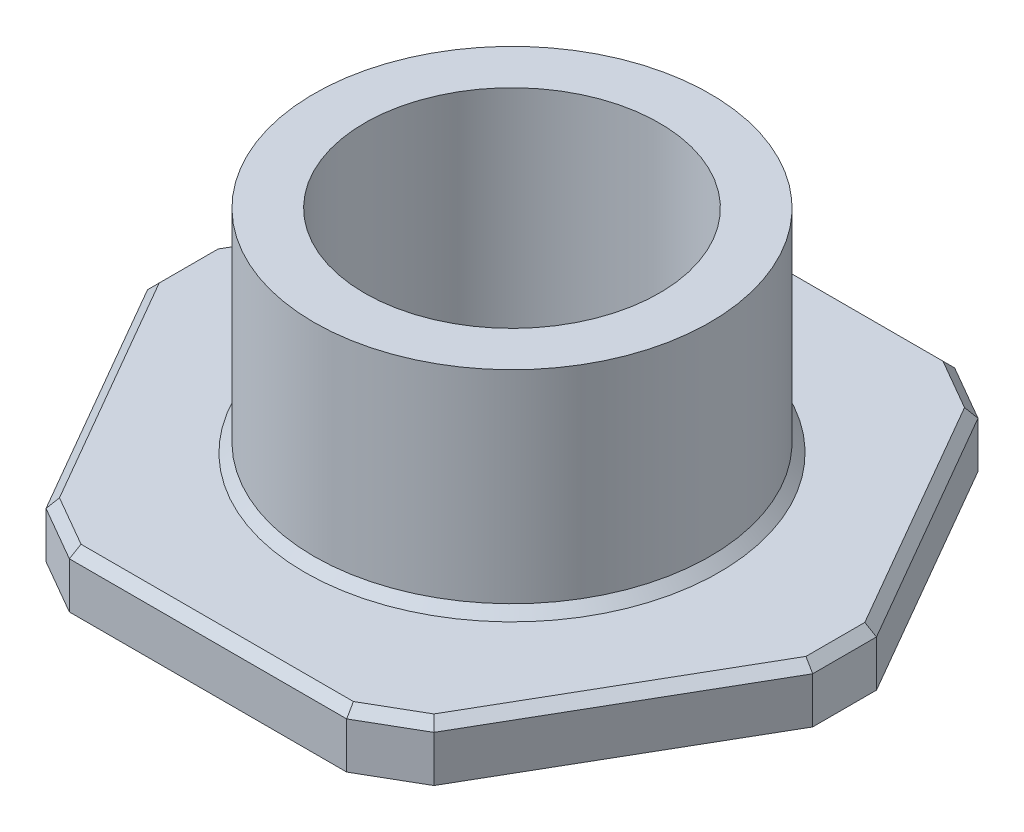
ISO-10303-21;
HEADER;
FILE_DESCRIPTION(('STEP AP214'),'2;1');
FILE_NAME('part.step','',(''),(''),'','','');
FILE_SCHEMA(('AUTOMOTIVE_DESIGN { 1 0 10303 214 1 1 1 1 }'));
ENDSEC;
DATA;
#1=APPLICATION_CONTEXT('core data for automotive mechanical design processes');
#2=APPLICATION_PROTOCOL_DEFINITION('international standard','automotive_design',2000,#1);
#3=PRODUCT_CONTEXT('',#1,'mechanical');
#4=PRODUCT('Part','Part','',(#3));
#5=PRODUCT_RELATED_PRODUCT_CATEGORY('part','',(#4));
#6=PRODUCT_DEFINITION_FORMATION('','',#4);
#7=PRODUCT_DEFINITION_CONTEXT('part definition',#1,'design');
#8=PRODUCT_DEFINITION('design','',#6,#7);
#9=PRODUCT_DEFINITION_SHAPE('','',#8);
#10=(LENGTH_UNIT() NAMED_UNIT(*) SI_UNIT(.MILLI.,.METRE.));
#11=(NAMED_UNIT(*) PLANE_ANGLE_UNIT() SI_UNIT($,.RADIAN.));
#12=(NAMED_UNIT(*) SI_UNIT($,.STERADIAN.) SOLID_ANGLE_UNIT());
#13=UNCERTAINTY_MEASURE_WITH_UNIT(LENGTH_MEASURE(1.E-05),#10,'distance_accuracy_value','');
#14=(GEOMETRIC_REPRESENTATION_CONTEXT(3) GLOBAL_UNCERTAINTY_ASSIGNED_CONTEXT((#13)) GLOBAL_UNIT_ASSIGNED_CONTEXT((#10,
#11,#12)) REPRESENTATION_CONTEXT('',''));
#15=CARTESIAN_POINT('',(0.,0.,0.));
#16=DIRECTION('',(0.,0.,1.));
#17=DIRECTION('',(1.,0.,0.));
#18=AXIS2_PLACEMENT_3D('',#15,#16,#17);
#19=CARTESIAN_POINT('',(0.,6.,0.));
#20=DIRECTION('',(0.,1.,0.));
#21=DIRECTION('',(0.,0.,1.));
#22=AXIS2_PLACEMENT_3D('',#19,#20,#21);
#23=PLANE('',#22);
#24=CARTESIAN_POINT('',(0.,6.,0.));
#25=DIRECTION('',(0.,1.,0.));
#26=DIRECTION('',(0.,0.,1.));
#27=AXIS2_PLACEMENT_3D('',#24,#25,#26);
#28=CIRCLE('',#27,22.4999999999999);
#29=CARTESIAN_POINT('',(0.,6.,22.4999999999999));
#30=VERTEX_POINT('',#29);
#31=EDGE_CURVE('E299',#30,#30,#28,.F.);
#32=ORIENTED_EDGE('',*,*,#31,.T.);
#33=EDGE_LOOP('',(#32));
#34=FACE_BOUND('',#33,.T.);
#35=DIRECTION('',(-1.,0.,0.));
#36=VECTOR('',#35,1.);
#37=CARTESIAN_POINT('',(-15.0525588832576,6.,-32.));
#38=LINE('',#37,#36);
#39=CARTESIAN_POINT('',(14.7846096908265,6.,-32.));
#40=VERTEX_POINT('',#39);
#41=CARTESIAN_POINT('',(-14.7846096908265,6.,-32.));
#42=VERTEX_POINT('',#41);
#43=EDGE_CURVE('E292',#40,#42,#38,.T.);
#44=ORIENTED_EDGE('',*,*,#43,.T.);
#45=DIRECTION('',(-0.866025403784438,0.,0.500000000000001));
#46=VECTOR('',#45,1.);
#47=CARTESIAN_POINT('',(-17.5525588832577,6.,-30.4019237886467));
#48=LINE('',#47,#46);
#49=CARTESIAN_POINT('',(-20.3205080756888,6.,-28.8038475772933));
#50=VERTEX_POINT('',#49);
#51=EDGE_CURVE('E295',#42,#50,#48,.T.);
#52=ORIENTED_EDGE('',*,*,#51,.T.);
#53=DIRECTION('',(-0.5,0.,0.866025403784439));
#54=VECTOR('',#53,1.);
#55=CARTESIAN_POINT('',(-35.2390923627309,6.,-2.9641016151378));
#56=LINE('',#55,#54);
#57=CARTESIAN_POINT('',(-35.1051177665153,6.,-3.19615242270667));
#58=VERTEX_POINT('',#57);
#59=EDGE_CURVE('E262',#50,#58,#56,.T.);
#60=ORIENTED_EDGE('',*,*,#59,.T.);
#61=DIRECTION('',(0.,0.,1.));
#62=VECTOR('',#61,1.);
#63=CARTESIAN_POINT('',(-35.1051177665153,6.,0.));
#64=LINE('',#63,#62);
#65=CARTESIAN_POINT('',(-35.1051177665153,6.,3.19615242270665));
#66=VERTEX_POINT('',#65);
#67=EDGE_CURVE('E265',#58,#66,#64,.T.);
#68=ORIENTED_EDGE('',*,*,#67,.T.);
#69=DIRECTION('',(0.5,0.,0.866025403784439));
#70=VECTOR('',#69,1.);
#71=CARTESIAN_POINT('',(-20.1865334794732,6.,29.0358983848622));
#72=LINE('',#71,#70);
#73=CARTESIAN_POINT('',(-20.3205080756888,6.,28.8038475772934));
#74=VERTEX_POINT('',#73);
#75=EDGE_CURVE('E268',#66,#74,#72,.T.);
#76=ORIENTED_EDGE('',*,*,#75,.T.);
#77=DIRECTION('',(0.866025403784438,0.,0.500000000000001));
#78=VECTOR('',#77,1.);
#79=CARTESIAN_POINT('',(-17.5525588832577,6.,30.4019237886467));
#80=LINE('',#79,#78);
#81=CARTESIAN_POINT('',(-14.7846096908265,6.,32.));
#82=VERTEX_POINT('',#81);
#83=EDGE_CURVE('E271',#74,#82,#80,.T.);
#84=ORIENTED_EDGE('',*,*,#83,.T.);
#85=DIRECTION('',(1.,0.,0.));
#86=VECTOR('',#85,1.);
#87=CARTESIAN_POINT('',(15.0525588832576,6.,32.));
#88=LINE('',#87,#86);
#89=CARTESIAN_POINT('',(14.7846096908265,6.,32.));
#90=VERTEX_POINT('',#89);
#91=EDGE_CURVE('E274',#82,#90,#88,.T.);
#92=ORIENTED_EDGE('',*,*,#91,.T.);
#93=DIRECTION('',(0.866025403784438,0.,-0.500000000000001));
#94=VECTOR('',#93,1.);
#95=CARTESIAN_POINT('',(17.5525588832577,6.,30.4019237886467));
#96=LINE('',#95,#94);
#97=CARTESIAN_POINT('',(20.3205080756888,6.,28.8038475772934));
#98=VERTEX_POINT('',#97);
#99=EDGE_CURVE('E277',#90,#98,#96,.T.);
#100=ORIENTED_EDGE('',*,*,#99,.T.);
#101=DIRECTION('',(0.5,0.,-0.866025403784439));
#102=VECTOR('',#101,1.);
#103=CARTESIAN_POINT('',(35.2390923627309,6.,2.96410161513777));
#104=LINE('',#103,#102);
#105=CARTESIAN_POINT('',(35.1051177665153,6.,3.19615242270664));
#106=VERTEX_POINT('',#105);
#107=EDGE_CURVE('E280',#98,#106,#104,.T.);
#108=ORIENTED_EDGE('',*,*,#107,.T.);
#109=DIRECTION('',(0.,0.,-1.));
#110=VECTOR('',#109,1.);
#111=CARTESIAN_POINT('',(35.1051177665153,6.,0.));
#112=LINE('',#111,#110);
#113=CARTESIAN_POINT('',(35.1051177665153,6.,-3.19615242270665));
#114=VERTEX_POINT('',#113);
#115=EDGE_CURVE('E283',#106,#114,#112,.T.);
#116=ORIENTED_EDGE('',*,*,#115,.T.);
#117=DIRECTION('',(-0.5,0.,-0.866025403784439));
#118=VECTOR('',#117,1.);
#119=CARTESIAN_POINT('',(20.1865334794732,6.,-29.0358983848622));
#120=LINE('',#119,#118);
#121=CARTESIAN_POINT('',(20.3205080756888,6.,-28.8038475772934));
#122=VERTEX_POINT('',#121);
#123=EDGE_CURVE('E286',#114,#122,#120,.T.);
#124=ORIENTED_EDGE('',*,*,#123,.T.);
#125=DIRECTION('',(-0.866025403784439,0.,-0.5));
#126=VECTOR('',#125,1.);
#127=CARTESIAN_POINT('',(17.5525588832576,6.,-30.4019237886467));
#128=LINE('',#127,#126);
#129=EDGE_CURVE('E289',#122,#40,#128,.T.);
#130=ORIENTED_EDGE('',*,*,#129,.T.);
#131=EDGE_LOOP('',(#44,#52,#60,#68,#76,#84,#92,#100,#108,#116,#124,#130));
#132=FACE_BOUND('',#131,.T.);
#133=ADVANCED_FACE('F47',(#34,#132),#23,.T.);
#134=CARTESIAN_POINT('',(0.,0.,0.));
#135=DIRECTION('',(0.,1.,0.));
#136=DIRECTION('',(0.,0.,1.));
#137=AXIS2_PLACEMENT_3D('',#134,#135,#136);
#138=PLANE('',#137);
#139=DIRECTION('',(0.5,0.,0.866025403784439));
#140=VECTOR('',#139,1.);
#141=CARTESIAN_POINT('',(-38.1051177665153,0.,0.));
#142=LINE('',#141,#140);
#143=CARTESIAN_POINT('',(-36.1051177665153,0.,3.46410161513778));
#144=VERTEX_POINT('',#143);
#145=CARTESIAN_POINT('',(-21.0525588832577,0.,29.5358983848622));
#146=VERTEX_POINT('',#145);
#147=EDGE_CURVE('E178',#144,#146,#142,.T.);
#148=ORIENTED_EDGE('',*,*,#147,.F.);
#149=DIRECTION('',(0.,0.,1.));
#150=VECTOR('',#149,1.);
#151=CARTESIAN_POINT('',(-36.1051177665153,0.,3.46410161513778));
#152=LINE('',#151,#150);
#153=CARTESIAN_POINT('',(-36.1051177665153,0.,-3.46410161513779));
#154=VERTEX_POINT('',#153);
#155=EDGE_CURVE('E185',#144,#154,#152,.F.);
#156=ORIENTED_EDGE('',*,*,#155,.T.);
#157=DIRECTION('',(-0.5,0.,0.866025403784439));
#158=VECTOR('',#157,1.);
#159=CARTESIAN_POINT('',(-19.0525588832577,0.,-33.));
#160=LINE('',#159,#158);
#161=CARTESIAN_POINT('',(-21.0525588832577,0.,-29.5358983848622));
#162=VERTEX_POINT('',#161);
#163=EDGE_CURVE('E201',#162,#154,#160,.T.);
#164=ORIENTED_EDGE('',*,*,#163,.F.);
#165=DIRECTION('',(-0.866025403784438,0.,0.500000000000001));
#166=VECTOR('',#165,1.);
#167=CARTESIAN_POINT('',(-21.0525588832577,0.,-29.5358983848622));
#168=LINE('',#167,#166);
#169=CARTESIAN_POINT('',(-15.0525588832576,0.,-33.));
#170=VERTEX_POINT('',#169);
#171=EDGE_CURVE('E182',#162,#170,#168,.F.);
#172=ORIENTED_EDGE('',*,*,#171,.T.);
#173=DIRECTION('',(-1.,0.,0.));
#174=VECTOR('',#173,1.);
#175=CARTESIAN_POINT('',(19.0525588832576,0.,-33.));
#176=LINE('',#175,#174);
#177=CARTESIAN_POINT('',(15.0525588832576,0.,-33.));
#178=VERTEX_POINT('',#177);
#179=EDGE_CURVE('E207',#178,#170,#176,.T.);
#180=ORIENTED_EDGE('',*,*,#179,.F.);
#181=DIRECTION('',(-0.866025403784439,0.,-0.5));
#182=VECTOR('',#181,1.);
#183=CARTESIAN_POINT('',(15.0525588832576,0.,-33.));
#184=LINE('',#183,#182);
#185=CARTESIAN_POINT('',(21.0525588832577,0.,-29.5358983848622));
#186=VERTEX_POINT('',#185);
#187=EDGE_CURVE('E215',#178,#186,#184,.F.);
#188=ORIENTED_EDGE('',*,*,#187,.T.);
#189=DIRECTION('',(-0.5,0.,-0.866025403784439));
#190=VECTOR('',#189,1.);
#191=CARTESIAN_POINT('',(38.1051177665153,0.,0.));
#192=LINE('',#191,#190);
#193=CARTESIAN_POINT('',(36.1051177665153,0.,-3.46410161513778));
#194=VERTEX_POINT('',#193);
#195=EDGE_CURVE('E404',#194,#186,#192,.T.);
#196=ORIENTED_EDGE('',*,*,#195,.F.);
#197=DIRECTION('',(0.,0.,-1.));
#198=VECTOR('',#197,1.);
#199=CARTESIAN_POINT('',(36.1051177665153,0.,-3.46410161513778));
#200=LINE('',#199,#198);
#201=CARTESIAN_POINT('',(36.1051177665153,0.,3.46410161513776));
#202=VERTEX_POINT('',#201);
#203=EDGE_CURVE('E218',#194,#202,#200,.F.);
#204=ORIENTED_EDGE('',*,*,#203,.T.);
#205=DIRECTION('',(0.5,0.,-0.866025403784439));
#206=VECTOR('',#205,1.);
#207=CARTESIAN_POINT('',(19.0525588832577,0.,33.));
#208=LINE('',#207,#206);
#209=CARTESIAN_POINT('',(21.0525588832577,0.,29.5358983848622));
#210=VERTEX_POINT('',#209);
#211=EDGE_CURVE('E400',#210,#202,#208,.T.);
#212=ORIENTED_EDGE('',*,*,#211,.F.);
#213=DIRECTION('',(0.866025403784438,0.,-0.500000000000001));
#214=VECTOR('',#213,1.);
#215=CARTESIAN_POINT('',(21.0525588832577,0.,29.5358983848622));
#216=LINE('',#215,#214);
#217=CARTESIAN_POINT('',(15.0525588832576,0.,33.));
#218=VERTEX_POINT('',#217);
#219=EDGE_CURVE('E221',#210,#218,#216,.F.);
#220=ORIENTED_EDGE('',*,*,#219,.T.);
#221=DIRECTION('',(1.,0.,0.));
#222=VECTOR('',#221,1.);
#223=CARTESIAN_POINT('',(-19.0525588832577,0.,33.));
#224=LINE('',#223,#222);
#225=CARTESIAN_POINT('',(-15.0525588832577,0.,33.));
#226=VERTEX_POINT('',#225);
#227=EDGE_CURVE('E200',#226,#218,#224,.T.);
#228=ORIENTED_EDGE('',*,*,#227,.F.);
#229=DIRECTION('',(0.866025403784438,0.,0.500000000000001));
#230=VECTOR('',#229,1.);
#231=CARTESIAN_POINT('',(-15.0525588832577,0.,33.));
#232=LINE('',#231,#230);
#233=EDGE_CURVE('E193',#226,#146,#232,.F.);
#234=ORIENTED_EDGE('',*,*,#233,.T.);
#235=EDGE_LOOP('',(#148,#156,#164,#172,#180,#188,#196,#204,#212,#220,#228,#234));
#236=FACE_BOUND('',#235,.T.);
#237=CARTESIAN_POINT('',(0.,0.,0.));
#238=DIRECTION('',(0.,1.,0.));
#239=DIRECTION('',(0.,0.,1.));
#240=AXIS2_PLACEMENT_3D('',#237,#238,#239);
#241=CIRCLE('',#240,16.);
#242=CARTESIAN_POINT('',(0.,0.,16.));
#243=VERTEX_POINT('',#242);
#244=EDGE_CURVE('E394',#243,#243,#241,.T.);
#245=ORIENTED_EDGE('',*,*,#244,.T.);
#246=EDGE_LOOP('',(#245));
#247=FACE_BOUND('',#246,.T.);
#248=ADVANCED_FACE('F195',(#236,#247),#138,.F.);
#249=CARTESIAN_POINT('',(19.0525588832577,6.,33.));
#250=DIRECTION('',(-0.866025403784439,0.,-0.5));
#251=DIRECTION('',(-0.5,0.,0.866025403784439));
#252=AXIS2_PLACEMENT_3D('',#249,#250,#251);
#253=PLANE('',#252);
#254=DIRECTION('',(0.,1.,0.));
#255=VECTOR('',#254,1.);
#256=CARTESIAN_POINT('',(36.1051177665153,6.,3.46410161513776));
#257=LINE('',#256,#255);
#258=CARTESIAN_POINT('',(36.1051177665153,5.,3.46410161513776));
#259=VERTEX_POINT('',#258);
#260=EDGE_CURVE('E237',#202,#259,#257,.T.);
#261=ORIENTED_EDGE('',*,*,#260,.T.);
#262=DIRECTION('',(-0.5,0.,0.866025403784439));
#263=VECTOR('',#262,1.);
#264=CARTESIAN_POINT('',(21.0525588832577,5.,29.5358983848622));
#265=LINE('',#264,#263);
#266=CARTESIAN_POINT('',(21.0525588832577,5.,29.5358983848622));
#267=VERTEX_POINT('',#266);
#268=EDGE_CURVE('E319',#259,#267,#265,.T.);
#269=ORIENTED_EDGE('',*,*,#268,.T.);
#270=DIRECTION('',(0.,-1.,0.));
#271=VECTOR('',#270,1.);
#272=CARTESIAN_POINT('',(21.0525588832577,6.,29.5358983848622));
#273=LINE('',#272,#271);
#274=EDGE_CURVE('E241',#267,#210,#273,.T.);
#275=ORIENTED_EDGE('',*,*,#274,.T.);
#276=ORIENTED_EDGE('',*,*,#211,.T.);
#277=EDGE_LOOP('',(#261,#269,#275,#276));
#278=FACE_BOUND('',#277,.T.);
#279=ADVANCED_FACE('F466',(#278),#253,.F.);
#280=CARTESIAN_POINT('',(38.1051177665153,6.,0.));
#281=DIRECTION('',(-0.866025403784439,0.,0.5));
#282=DIRECTION('',(0.5,0.,0.866025403784439));
#283=AXIS2_PLACEMENT_3D('',#280,#281,#282);
#284=PLANE('',#283);
#285=DIRECTION('',(0.,1.,0.));
#286=VECTOR('',#285,1.);
#287=CARTESIAN_POINT('',(21.0525588832577,6.,-29.5358983848622));
#288=LINE('',#287,#286);
#289=CARTESIAN_POINT('',(21.0525588832577,5.,-29.5358983848622));
#290=VERTEX_POINT('',#289);
#291=EDGE_CURVE('E244',#186,#290,#288,.T.);
#292=ORIENTED_EDGE('',*,*,#291,.T.);
#293=DIRECTION('',(0.5,0.,0.866025403784439));
#294=VECTOR('',#293,1.);
#295=CARTESIAN_POINT('',(36.1051177665153,5.,-3.46410161513778));
#296=LINE('',#295,#294);
#297=CARTESIAN_POINT('',(36.1051177665153,5.,-3.46410161513778));
#298=VERTEX_POINT('',#297);
#299=EDGE_CURVE('E313',#290,#298,#296,.T.);
#300=ORIENTED_EDGE('',*,*,#299,.T.);
#301=DIRECTION('',(0.,-1.,0.));
#302=VECTOR('',#301,1.);
#303=CARTESIAN_POINT('',(36.1051177665153,6.,-3.46410161513778));
#304=LINE('',#303,#302);
#305=EDGE_CURVE('E248',#298,#194,#304,.T.);
#306=ORIENTED_EDGE('',*,*,#305,.T.);
#307=ORIENTED_EDGE('',*,*,#195,.T.);
#308=EDGE_LOOP('',(#292,#300,#306,#307));
#309=FACE_BOUND('',#308,.T.);
#310=ADVANCED_FACE('F452',(#309),#284,.F.);
#311=CARTESIAN_POINT('',(19.0525588832576,6.,-33.));
#312=DIRECTION('',(0.,0.,1.));
#313=DIRECTION('',(1.,0.,0.));
#314=AXIS2_PLACEMENT_3D('',#311,#312,#313);
#315=PLANE('',#314);
#316=DIRECTION('',(0.,1.,0.));
#317=VECTOR('',#316,1.);
#318=CARTESIAN_POINT('',(-15.0525588832576,6.,-33.));
#319=LINE('',#318,#317);
#320=CARTESIAN_POINT('',(-15.0525588832576,5.,-33.));
#321=VERTEX_POINT('',#320);
#322=EDGE_CURVE('E251',#170,#321,#319,.T.);
#323=ORIENTED_EDGE('',*,*,#322,.T.);
#324=DIRECTION('',(1.,0.,0.));
#325=VECTOR('',#324,1.);
#326=CARTESIAN_POINT('',(15.0525588832576,5.,-33.));
#327=LINE('',#326,#325);
#328=CARTESIAN_POINT('',(15.0525588832576,5.,-33.));
#329=VERTEX_POINT('',#328);
#330=EDGE_CURVE('E307',#321,#329,#327,.T.);
#331=ORIENTED_EDGE('',*,*,#330,.T.);
#332=DIRECTION('',(0.,-1.,0.));
#333=VECTOR('',#332,1.);
#334=CARTESIAN_POINT('',(15.0525588832576,6.,-33.));
#335=LINE('',#334,#333);
#336=EDGE_CURVE('E255',#329,#178,#335,.T.);
#337=ORIENTED_EDGE('',*,*,#336,.T.);
#338=ORIENTED_EDGE('',*,*,#179,.T.);
#339=EDGE_LOOP('',(#323,#331,#337,#338));
#340=FACE_BOUND('',#339,.T.);
#341=ADVANCED_FACE('F412',(#340),#315,.F.);
#342=CARTESIAN_POINT('',(-19.0525588832577,6.,-33.));
#343=DIRECTION('',(0.866025403784439,0.,0.5));
#344=DIRECTION('',(0.5,0.,-0.866025403784439));
#345=AXIS2_PLACEMENT_3D('',#342,#343,#344);
#346=PLANE('',#345);
#347=DIRECTION('',(0.,1.,0.));
#348=VECTOR('',#347,1.);
#349=CARTESIAN_POINT('',(-36.1051177665153,6.,-3.46410161513778));
#350=LINE('',#349,#348);
#351=CARTESIAN_POINT('',(-36.1051177665153,5.,-3.46410161513778));
#352=VERTEX_POINT('',#351);
#353=EDGE_CURVE('E187',#154,#352,#350,.T.);
#354=ORIENTED_EDGE('',*,*,#353,.T.);
#355=DIRECTION('',(0.5,0.,-0.866025403784439));
#356=VECTOR('',#355,1.);
#357=CARTESIAN_POINT('',(-21.0525588832577,5.,-29.5358983848622));
#358=LINE('',#357,#356);
#359=CARTESIAN_POINT('',(-21.0525588832577,5.,-29.5358983848622));
#360=VERTEX_POINT('',#359);
#361=EDGE_CURVE('E11',#352,#360,#358,.T.);
#362=ORIENTED_EDGE('',*,*,#361,.T.);
#363=DIRECTION('',(0.,-1.,0.));
#364=VECTOR('',#363,1.);
#365=CARTESIAN_POINT('',(-21.0525588832577,6.,-29.5358983848622));
#366=LINE('',#365,#364);
#367=EDGE_CURVE('E192',#360,#162,#366,.T.);
#368=ORIENTED_EDGE('',*,*,#367,.T.);
#369=ORIENTED_EDGE('',*,*,#163,.T.);
#370=EDGE_LOOP('',(#354,#362,#368,#369));
#371=FACE_BOUND('',#370,.T.);
#372=ADVANCED_FACE('F516',(#371),#346,.F.);
#373=CARTESIAN_POINT('',(-38.1051177665153,6.,0.));
#374=DIRECTION('',(0.866025403784439,0.,-0.5));
#375=DIRECTION('',(-0.5,0.,-0.866025403784439));
#376=AXIS2_PLACEMENT_3D('',#373,#374,#375);
#377=PLANE('',#376);
#378=DIRECTION('',(0.,1.,0.));
#379=VECTOR('',#378,1.);
#380=CARTESIAN_POINT('',(-21.0525588832577,6.,29.5358983848622));
#381=LINE('',#380,#379);
#382=CARTESIAN_POINT('',(-21.0525588832577,5.,29.5358983848622));
#383=VERTEX_POINT('',#382);
#384=EDGE_CURVE('E183',#146,#383,#381,.T.);
#385=ORIENTED_EDGE('',*,*,#384,.T.);
#386=DIRECTION('',(-0.5,0.,-0.866025403784439));
#387=VECTOR('',#386,1.);
#388=CARTESIAN_POINT('',(-36.1051177665153,5.,3.46410161513778));
#389=LINE('',#388,#387);
#390=CARTESIAN_POINT('',(-36.1051177665153,5.,3.46410161513778));
#391=VERTEX_POINT('',#390);
#392=EDGE_CURVE('E73',#383,#391,#389,.T.);
#393=ORIENTED_EDGE('',*,*,#392,.T.);
#394=DIRECTION('',(0.,-1.,0.));
#395=VECTOR('',#394,1.);
#396=CARTESIAN_POINT('',(-36.1051177665153,6.,3.46410161513778));
#397=LINE('',#396,#395);
#398=EDGE_CURVE('E174',#391,#144,#397,.T.);
#399=ORIENTED_EDGE('',*,*,#398,.T.);
#400=ORIENTED_EDGE('',*,*,#147,.T.);
#401=EDGE_LOOP('',(#385,#393,#399,#400));
#402=FACE_BOUND('',#401,.T.);
#403=ADVANCED_FACE('F176',(#402),#377,.F.);
#404=CARTESIAN_POINT('',(-19.0525588832577,6.,33.));
#405=DIRECTION('',(0.,0.,-1.));
#406=DIRECTION('',(-1.,0.,0.));
#407=AXIS2_PLACEMENT_3D('',#404,#405,#406);
#408=PLANE('',#407);
#409=DIRECTION('',(0.,1.,0.));
#410=VECTOR('',#409,1.);
#411=CARTESIAN_POINT('',(15.0525588832576,6.,33.));
#412=LINE('',#411,#410);
#413=CARTESIAN_POINT('',(15.0525588832576,5.,33.));
#414=VERTEX_POINT('',#413);
#415=EDGE_CURVE('E230',#218,#414,#412,.T.);
#416=ORIENTED_EDGE('',*,*,#415,.T.);
#417=DIRECTION('',(-1.,0.,0.));
#418=VECTOR('',#417,1.);
#419=CARTESIAN_POINT('',(-15.0525588832577,5.,33.));
#420=LINE('',#419,#418);
#421=CARTESIAN_POINT('',(-15.0525588832577,5.,33.));
#422=VERTEX_POINT('',#421);
#423=EDGE_CURVE('E325',#414,#422,#420,.T.);
#424=ORIENTED_EDGE('',*,*,#423,.T.);
#425=DIRECTION('',(0.,-1.,0.));
#426=VECTOR('',#425,1.);
#427=CARTESIAN_POINT('',(-15.0525588832577,6.,33.));
#428=LINE('',#427,#426);
#429=EDGE_CURVE('E234',#422,#226,#428,.T.);
#430=ORIENTED_EDGE('',*,*,#429,.T.);
#431=ORIENTED_EDGE('',*,*,#227,.T.);
#432=EDGE_LOOP('',(#416,#424,#430,#431));
#433=FACE_BOUND('',#432,.T.);
#434=ADVANCED_FACE('F480',(#433),#408,.F.);
#435=CARTESIAN_POINT('',(0.,6.,0.));
#436=DIRECTION('',(0.,-1.,0.));
#437=DIRECTION('',(0.,0.,-1.));
#438=AXIS2_PLACEMENT_3D('',#435,#436,#437);
#439=CYLINDRICAL_SURFACE('',#438,16.);
#440=ORIENTED_EDGE('',*,*,#244,.F.);
#441=EDGE_LOOP('',(#440));
#442=FACE_BOUND('',#441,.T.);
#443=CARTESIAN_POINT('',(0.,29.,0.));
#444=DIRECTION('',(0.,1.,0.));
#445=DIRECTION('',(0.,0.,1.));
#446=AXIS2_PLACEMENT_3D('',#443,#444,#445);
#447=CIRCLE('',#446,16.);
#448=CARTESIAN_POINT('',(0.,29.,16.));
#449=VERTEX_POINT('',#448);
#450=EDGE_CURVE('E381',#449,#449,#447,.T.);
#451=ORIENTED_EDGE('',*,*,#450,.T.);
#452=EDGE_LOOP('',(#451));
#453=FACE_BOUND('',#452,.T.);
#454=ADVANCED_FACE('F509',(#442,#453),#439,.F.);
#455=CARTESIAN_POINT('',(0.,29.,0.));
#456=DIRECTION('',(0.,1.,0.));
#457=DIRECTION('',(0.,0.,1.));
#458=AXIS2_PLACEMENT_3D('',#455,#456,#457);
#459=PLANE('',#458);
#460=CARTESIAN_POINT('',(0.,29.,0.));
#461=DIRECTION('',(0.,1.,0.));
#462=DIRECTION('',(0.,0.,1.));
#463=AXIS2_PLACEMENT_3D('',#460,#461,#462);
#464=CIRCLE('',#463,21.5);
#465=CARTESIAN_POINT('',(0.,29.,21.5));
#466=VERTEX_POINT('',#465);
#467=EDGE_CURVE('E388',#466,#466,#464,.T.);
#468=ORIENTED_EDGE('',*,*,#467,.T.);
#469=EDGE_LOOP('',(#468));
#470=FACE_BOUND('',#469,.T.);
#471=ORIENTED_EDGE('',*,*,#450,.F.);
#472=EDGE_LOOP('',(#471));
#473=FACE_BOUND('',#472,.T.);
#474=ADVANCED_FACE('F647',(#470,#473),#459,.T.);
#475=CARTESIAN_POINT('',(0.,29.,0.));
#476=DIRECTION('',(0.,-1.,0.));
#477=DIRECTION('',(0.,0.,-1.));
#478=AXIS2_PLACEMENT_3D('',#475,#476,#477);
#479=CYLINDRICAL_SURFACE('',#478,21.5);
#480=CARTESIAN_POINT('',(0.,6.99999999999995,0.));
#481=DIRECTION('',(0.,1.,0.));
#482=DIRECTION('',(0.,0.,1.));
#483=AXIS2_PLACEMENT_3D('',#480,#481,#482);
#484=CIRCLE('',#483,21.5);
#485=CARTESIAN_POINT('',(0.,6.99999999999995,21.5));
#486=VERTEX_POINT('',#485);
#487=EDGE_CURVE('E258',#486,#486,#484,.T.);
#488=ORIENTED_EDGE('',*,*,#487,.T.);
#489=EDGE_LOOP('',(#488));
#490=FACE_BOUND('',#489,.T.);
#491=ORIENTED_EDGE('',*,*,#467,.F.);
#492=EDGE_LOOP('',(#491));
#493=FACE_BOUND('',#492,.T.);
#494=ADVANCED_FACE('F532',(#490,#493),#479,.T.);
#495=CARTESIAN_POINT('',(-36.1051177665153,6.,3.46410161513778));
#496=DIRECTION('',(1.,0.,0.));
#497=DIRECTION('',(0.,-1.,0.));
#498=AXIS2_PLACEMENT_3D('',#495,#496,#497);
#499=PLANE('',#498);
#500=ORIENTED_EDGE('',*,*,#398,.F.);
#501=DIRECTION('',(0.,0.,1.));
#502=VECTOR('',#501,1.);
#503=CARTESIAN_POINT('',(-36.1051177665153,5.,3.46410161513778));
#504=LINE('',#503,#502);
#505=EDGE_CURVE('E58',#391,#352,#504,.F.);
#506=ORIENTED_EDGE('',*,*,#505,.T.);
#507=ORIENTED_EDGE('',*,*,#353,.F.);
#508=ORIENTED_EDGE('',*,*,#155,.F.);
#509=EDGE_LOOP('',(#500,#506,#507,#508));
#510=FACE_BOUND('',#509,.T.);
#511=ADVANCED_FACE('F186',(#510),#499,.F.);
#512=CARTESIAN_POINT('',(-15.0525588832577,6.,33.));
#513=DIRECTION('',(0.500000000000001,0.,-0.866025403784438));
#514=DIRECTION('',(0.,-1.,0.));
#515=AXIS2_PLACEMENT_3D('',#512,#513,#514);
#516=PLANE('',#515);
#517=ORIENTED_EDGE('',*,*,#429,.F.);
#518=DIRECTION('',(0.866025403784438,0.,0.500000000000001));
#519=VECTOR('',#518,1.);
#520=CARTESIAN_POINT('',(-15.0525588832577,5.,33.));
#521=LINE('',#520,#519);
#522=EDGE_CURVE('E328',#422,#383,#521,.F.);
#523=ORIENTED_EDGE('',*,*,#522,.T.);
#524=ORIENTED_EDGE('',*,*,#384,.F.);
#525=ORIENTED_EDGE('',*,*,#233,.F.);
#526=EDGE_LOOP('',(#517,#523,#524,#525));
#527=FACE_BOUND('',#526,.T.);
#528=ADVANCED_FACE('F482',(#527),#516,.F.);
#529=CARTESIAN_POINT('',(21.0525588832577,6.,29.5358983848622));
#530=DIRECTION('',(-0.500000000000001,0.,-0.866025403784438));
#531=DIRECTION('',(0.,-1.,0.));
#532=AXIS2_PLACEMENT_3D('',#529,#530,#531);
#533=PLANE('',#532);
#534=ORIENTED_EDGE('',*,*,#274,.F.);
#535=DIRECTION('',(0.866025403784438,0.,-0.500000000000001));
#536=VECTOR('',#535,1.);
#537=CARTESIAN_POINT('',(21.0525588832577,5.,29.5358983848622));
#538=LINE('',#537,#536);
#539=EDGE_CURVE('E322',#267,#414,#538,.F.);
#540=ORIENTED_EDGE('',*,*,#539,.T.);
#541=ORIENTED_EDGE('',*,*,#415,.F.);
#542=ORIENTED_EDGE('',*,*,#219,.F.);
#543=EDGE_LOOP('',(#534,#540,#541,#542));
#544=FACE_BOUND('',#543,.T.);
#545=ADVANCED_FACE('F470',(#544),#533,.F.);
#546=CARTESIAN_POINT('',(36.1051177665153,6.,-3.46410161513778));
#547=DIRECTION('',(-1.,0.,0.));
#548=DIRECTION('',(0.,-1.,0.));
#549=AXIS2_PLACEMENT_3D('',#546,#547,#548);
#550=PLANE('',#549);
#551=ORIENTED_EDGE('',*,*,#305,.F.);
#552=DIRECTION('',(0.,0.,-1.));
#553=VECTOR('',#552,1.);
#554=CARTESIAN_POINT('',(36.1051177665153,5.,-3.46410161513778));
#555=LINE('',#554,#553);
#556=EDGE_CURVE('E316',#298,#259,#555,.F.);
#557=ORIENTED_EDGE('',*,*,#556,.T.);
#558=ORIENTED_EDGE('',*,*,#260,.F.);
#559=ORIENTED_EDGE('',*,*,#203,.F.);
#560=EDGE_LOOP('',(#551,#557,#558,#559));
#561=FACE_BOUND('',#560,.T.);
#562=ADVANCED_FACE('F456',(#561),#550,.F.);
#563=CARTESIAN_POINT('',(15.0525588832576,6.,-33.));
#564=DIRECTION('',(-0.5,0.,0.866025403784439));
#565=DIRECTION('',(0.,-1.,0.));
#566=AXIS2_PLACEMENT_3D('',#563,#564,#565);
#567=PLANE('',#566);
#568=ORIENTED_EDGE('',*,*,#336,.F.);
#569=DIRECTION('',(-0.866025403784439,0.,-0.5));
#570=VECTOR('',#569,1.);
#571=CARTESIAN_POINT('',(15.0525588832576,5.,-33.));
#572=LINE('',#571,#570);
#573=EDGE_CURVE('E310',#329,#290,#572,.F.);
#574=ORIENTED_EDGE('',*,*,#573,.T.);
#575=ORIENTED_EDGE('',*,*,#291,.F.);
#576=ORIENTED_EDGE('',*,*,#187,.F.);
#577=EDGE_LOOP('',(#568,#574,#575,#576));
#578=FACE_BOUND('',#577,.T.);
#579=ADVANCED_FACE('F440',(#578),#567,.F.);
#580=CARTESIAN_POINT('',(-21.0525588832577,6.,-29.5358983848622));
#581=DIRECTION('',(0.500000000000001,0.,0.866025403784438));
#582=DIRECTION('',(0.,-1.,0.));
#583=AXIS2_PLACEMENT_3D('',#580,#581,#582);
#584=PLANE('',#583);
#585=ORIENTED_EDGE('',*,*,#367,.F.);
#586=DIRECTION('',(-0.866025403784438,0.,0.500000000000001));
#587=VECTOR('',#586,1.);
#588=CARTESIAN_POINT('',(-21.0525588832577,5.,-29.5358983848622));
#589=LINE('',#588,#587);
#590=EDGE_CURVE('E303',#360,#321,#589,.F.);
#591=ORIENTED_EDGE('',*,*,#590,.T.);
#592=ORIENTED_EDGE('',*,*,#322,.F.);
#593=ORIENTED_EDGE('',*,*,#171,.F.);
#594=EDGE_LOOP('',(#585,#591,#592,#593));
#595=FACE_BOUND('',#594,.T.);
#596=ADVANCED_FACE('F418',(#595),#584,.F.);
#597=CARTESIAN_POINT('',(0.,6.99999999999995,0.));
#598=DIRECTION('',(0.,-1.,0.));
#599=DIRECTION('',(0.,0.,-1.));
#600=AXIS2_PLACEMENT_3D('',#597,#598,#599);
#601=CONICAL_SURFACE('',#600,21.5,0.785398163397448);
#602=ORIENTED_EDGE('',*,*,#31,.F.);
#603=EDGE_LOOP('',(#602));
#604=FACE_BOUND('',#603,.T.);
#605=ORIENTED_EDGE('',*,*,#487,.F.);
#606=EDGE_LOOP('',(#605));
#607=FACE_BOUND('',#606,.T.);
#608=ADVANCED_FACE('F558',(#604,#607),#601,.T.);
#609=CARTESIAN_POINT('',(17.5525588832577,6.,30.4019237886467));
#610=DIRECTION('',(0.353553390593277,0.707106781186542,0.612372435695799));
#611=DIRECTION('',(-0.866025403784438,0.,0.500000000000001));
#612=AXIS2_PLACEMENT_3D('',#609,#610,#611);
#613=PLANE('',#612);
#614=DIRECTION('',(-0.186156787897384,0.694746590606871,-0.694746590606861));
#615=VECTOR('',#614,1.);
#616=CARTESIAN_POINT('',(14.2722586567143,7.91212009061734,30.0878799093827));
#617=LINE('',#616,#615);
#618=EDGE_CURVE('E372',#414,#90,#617,.T.);
#619=ORIENTED_EDGE('',*,*,#618,.F.);
#620=ORIENTED_EDGE('',*,*,#539,.F.);
#621=DIRECTION('',(-0.508589802709478,0.694746590606871,-0.508589802709476));
#622=VECTOR('',#621,1.);
#623=CARTESIAN_POINT('',(20.0179045335774,6.41336412579932,28.501244035182));
#624=LINE('',#623,#622);
#625=EDGE_CURVE('E52',#98,#267,#624,.F.);
#626=ORIENTED_EDGE('',*,*,#625,.F.);
#627=ORIENTED_EDGE('',*,*,#99,.F.);
#628=EDGE_LOOP('',(#619,#620,#626,#627));
#629=FACE_BOUND('',#628,.T.);
#630=ADVANCED_FACE('F50',(#629),#613,.T.);
#631=CARTESIAN_POINT('',(27.7128129211021,6.,16.));
#632=DIRECTION('',(0.612372435695799,0.707106781186543,0.353553390593276));
#633=DIRECTION('',(-0.5,0.,0.866025403784439));
#634=AXIS2_PLACEMENT_3D('',#631,#632,#633);
#635=PLANE('',#634);
#636=ORIENTED_EDGE('',*,*,#625,.T.);
#637=ORIENTED_EDGE('',*,*,#268,.F.);
#638=DIRECTION('',(-0.694746590606861,0.694746590606871,-0.186156787897384));
#639=VECTOR('',#638,1.);
#640=CARTESIAN_POINT('',(33.192997675898,7.91212009061735,2.68380138859441));
#641=LINE('',#640,#639);
#642=EDGE_CURVE('E369',#106,#259,#641,.F.);
#643=ORIENTED_EDGE('',*,*,#642,.F.);
#644=ORIENTED_EDGE('',*,*,#107,.F.);
#645=EDGE_LOOP('',(#636,#637,#643,#644));
#646=FACE_BOUND('',#645,.T.);
#647=ADVANCED_FACE('F463',(#646),#635,.T.);
#648=CARTESIAN_POINT('',(0.,6.,32.));
#649=DIRECTION('',(0.,0.707106781186543,0.707106781186552));
#650=DIRECTION('',(-1.,0.,0.));
#651=AXIS2_PLACEMENT_3D('',#648,#649,#650);
#652=PLANE('',#651);
#653=ORIENTED_EDGE('',*,*,#618,.T.);
#654=ORIENTED_EDGE('',*,*,#91,.F.);
#655=DIRECTION('',(0.186156787897384,0.694746590606871,-0.694746590606861));
#656=VECTOR('',#655,1.);
#657=CARTESIAN_POINT('',(-14.6738491071386,6.41336412579933,31.5866358742007));
#658=LINE('',#657,#656);
#659=EDGE_CURVE('E365',#422,#82,#658,.T.);
#660=ORIENTED_EDGE('',*,*,#659,.F.);
#661=ORIENTED_EDGE('',*,*,#423,.F.);
#662=EDGE_LOOP('',(#653,#654,#660,#661));
#663=FACE_BOUND('',#662,.T.);
#664=ADVANCED_FACE('F476',(#663),#652,.T.);
#665=CARTESIAN_POINT('',(35.1051177665153,6.,0.));
#666=DIRECTION('',(0.707106781186552,0.707106781186543,0.));
#667=DIRECTION('',(0.,0.,1.));
#668=AXIS2_PLACEMENT_3D('',#665,#666,#667);
#669=PLANE('',#668);
#670=ORIENTED_EDGE('',*,*,#642,.T.);
#671=ORIENTED_EDGE('',*,*,#556,.F.);
#672=DIRECTION('',(-0.69474659060686,0.694746590606869,0.186156787897396));
#673=VECTOR('',#672,1.);
#674=CARTESIAN_POINT('',(34.691753640716,6.41336412579935,-3.08539183901871));
#675=LINE('',#674,#673);
#676=EDGE_CURVE('E361',#114,#298,#675,.F.);
#677=ORIENTED_EDGE('',*,*,#676,.F.);
#678=ORIENTED_EDGE('',*,*,#115,.F.);
#679=EDGE_LOOP('',(#670,#671,#677,#678));
#680=FACE_BOUND('',#679,.T.);
#681=ADVANCED_FACE('F460',(#680),#669,.T.);
#682=CARTESIAN_POINT('',(-17.5525588832577,6.,30.4019237886467));
#683=DIRECTION('',(-0.353553390593277,0.707106781186542,0.612372435695799));
#684=DIRECTION('',(-0.866025403784438,0.,-0.500000000000001));
#685=AXIS2_PLACEMENT_3D('',#682,#683,#684);
#686=PLANE('',#685);
#687=ORIENTED_EDGE('',*,*,#659,.T.);
#688=ORIENTED_EDGE('',*,*,#83,.F.);
#689=DIRECTION('',(0.508589802709489,0.694746590606869,-0.508589802709467));
#690=VECTOR('',#689,1.);
#691=CARTESIAN_POINT('',(-18.9207390191838,7.9121200906172,27.4040785207884));
#692=LINE('',#691,#690);
#693=EDGE_CURVE('E357',#383,#74,#692,.T.);
#694=ORIENTED_EDGE('',*,*,#693,.F.);
#695=ORIENTED_EDGE('',*,*,#522,.F.);
#696=EDGE_LOOP('',(#687,#688,#694,#695));
#697=FACE_BOUND('',#696,.T.);
#698=ADVANCED_FACE('F486',(#697),#686,.T.);
#699=CARTESIAN_POINT('',(27.712812921102,6.,-16.));
#700=DIRECTION('',(0.612372435695796,0.707106781186546,-0.353553390593275));
#701=DIRECTION('',(0.5,0.,0.866025403784439));
#702=AXIS2_PLACEMENT_3D('',#699,#700,#701);
#703=PLANE('',#702);
#704=ORIENTED_EDGE('',*,*,#676,.T.);
#705=ORIENTED_EDGE('',*,*,#299,.F.);
#706=DIRECTION('',(-0.508589802709483,0.694746590606868,0.508589802709474));
#707=VECTOR('',#706,1.);
#708=CARTESIAN_POINT('',(18.9207390191837,7.91212009061728,-27.4040785207883));
#709=LINE('',#708,#707);
#710=EDGE_CURVE('E353',#122,#290,#709,.F.);
#711=ORIENTED_EDGE('',*,*,#710,.F.);
#712=ORIENTED_EDGE('',*,*,#123,.F.);
#713=EDGE_LOOP('',(#704,#705,#711,#712));
#714=FACE_BOUND('',#713,.T.);
#715=ADVANCED_FACE('F448',(#714),#703,.T.);
#716=CARTESIAN_POINT('',(-27.712812921102,6.,16.));
#717=DIRECTION('',(-0.612372435695796,0.707106781186546,0.353553390593274));
#718=DIRECTION('',(-0.5,0.,-0.866025403784439));
#719=AXIS2_PLACEMENT_3D('',#716,#717,#718);
#720=PLANE('',#719);
#721=ORIENTED_EDGE('',*,*,#693,.T.);
#722=ORIENTED_EDGE('',*,*,#75,.F.);
#723=DIRECTION('',(0.694746590606859,0.694746590606869,-0.186156787897398));
#724=VECTOR('',#723,1.);
#725=CARTESIAN_POINT('',(-34.691753640716,6.41336412579935,3.0853918390187));
#726=LINE('',#725,#724);
#727=EDGE_CURVE('E349',#391,#66,#726,.T.);
#728=ORIENTED_EDGE('',*,*,#727,.F.);
#729=ORIENTED_EDGE('',*,*,#392,.F.);
#730=EDGE_LOOP('',(#721,#722,#728,#729));
#731=FACE_BOUND('',#730,.T.);
#732=ADVANCED_FACE('F489',(#731),#720,.T.);
#733=CARTESIAN_POINT('',(17.5525588832576,6.,-30.4019237886467));
#734=DIRECTION('',(0.353553390593276,0.707106781186544,-0.612372435695798));
#735=DIRECTION('',(0.866025403784439,0.,0.5));
#736=AXIS2_PLACEMENT_3D('',#733,#734,#735);
#737=PLANE('',#736);
#738=ORIENTED_EDGE('',*,*,#710,.T.);
#739=ORIENTED_EDGE('',*,*,#573,.F.);
#740=DIRECTION('',(-0.186156787897389,0.69474659060687,0.694746590606861));
#741=VECTOR('',#740,1.);
#742=CARTESIAN_POINT('',(14.6738491071386,6.41336412579931,-31.5866358742007));
#743=LINE('',#742,#741);
#744=EDGE_CURVE('E345',#40,#329,#743,.F.);
#745=ORIENTED_EDGE('',*,*,#744,.F.);
#746=ORIENTED_EDGE('',*,*,#129,.F.);
#747=EDGE_LOOP('',(#738,#739,#745,#746));
#748=FACE_BOUND('',#747,.T.);
#749=ADVANCED_FACE('F443',(#748),#737,.T.);
#750=CARTESIAN_POINT('',(-35.1051177665153,6.,0.));
#751=DIRECTION('',(-0.707106781186552,0.707106781186543,0.));
#752=DIRECTION('',(0.,0.,-1.));
#753=AXIS2_PLACEMENT_3D('',#750,#751,#752);
#754=PLANE('',#753);
#755=ORIENTED_EDGE('',*,*,#727,.T.);
#756=ORIENTED_EDGE('',*,*,#67,.F.);
#757=DIRECTION('',(0.694746590606862,0.694746590606872,0.186156787897378));
#758=VECTOR('',#757,1.);
#759=CARTESIAN_POINT('',(-33.1929976758979,7.9121200906174,-2.68380138859444));
#760=LINE('',#759,#758);
#761=EDGE_CURVE('E341',#352,#58,#760,.T.);
#762=ORIENTED_EDGE('',*,*,#761,.F.);
#763=ORIENTED_EDGE('',*,*,#505,.F.);
#764=EDGE_LOOP('',(#755,#756,#762,#763));
#765=FACE_BOUND('',#764,.T.);
#766=ADVANCED_FACE('F491',(#765),#754,.T.);
#767=CARTESIAN_POINT('',(0.,6.,-32.));
#768=DIRECTION('',(0.,0.707106781186543,-0.707106781186552));
#769=DIRECTION('',(1.,0.,0.));
#770=AXIS2_PLACEMENT_3D('',#767,#768,#769);
#771=PLANE('',#770);
#772=ORIENTED_EDGE('',*,*,#744,.T.);
#773=ORIENTED_EDGE('',*,*,#330,.F.);
#774=DIRECTION('',(0.186156787897386,0.69474659060687,0.694746590606861));
#775=VECTOR('',#774,1.);
#776=CARTESIAN_POINT('',(-14.2722586567143,7.91212009061736,-30.0878799093827));
#777=LINE('',#776,#775);
#778=EDGE_CURVE('E338',#42,#321,#777,.F.);
#779=ORIENTED_EDGE('',*,*,#778,.F.);
#780=ORIENTED_EDGE('',*,*,#43,.F.);
#781=EDGE_LOOP('',(#772,#773,#779,#780));
#782=FACE_BOUND('',#781,.T.);
#783=ADVANCED_FACE('F437',(#782),#771,.T.);
#784=CARTESIAN_POINT('',(-27.7128129211021,6.,-16.));
#785=DIRECTION('',(-0.6123724356958,0.707106781186541,-0.353553390593277));
#786=DIRECTION('',(0.5,0.,-0.866025403784439));
#787=AXIS2_PLACEMENT_3D('',#784,#785,#786);
#788=PLANE('',#787);
#789=ORIENTED_EDGE('',*,*,#761,.T.);
#790=ORIENTED_EDGE('',*,*,#59,.F.);
#791=DIRECTION('',(-0.508589802709471,-0.694746590606871,-0.508589802709481));
#792=VECTOR('',#791,1.);
#793=CARTESIAN_POINT('',(-18.9207390191837,7.91212009061742,-27.4040785207882));
#794=LINE('',#793,#792);
#795=EDGE_CURVE('E335',#360,#50,#794,.F.);
#796=ORIENTED_EDGE('',*,*,#795,.F.);
#797=ORIENTED_EDGE('',*,*,#361,.F.);
#798=EDGE_LOOP('',(#789,#790,#796,#797));
#799=FACE_BOUND('',#798,.T.);
#800=ADVANCED_FACE('F429',(#799),#788,.T.);
#801=CARTESIAN_POINT('',(-17.5525588832577,6.,-30.4019237886467));
#802=DIRECTION('',(-0.353553390593276,0.707106781186543,-0.612372435695798));
#803=DIRECTION('',(0.866025403784438,0.,-0.500000000000001));
#804=AXIS2_PLACEMENT_3D('',#801,#802,#803);
#805=PLANE('',#804);
#806=ORIENTED_EDGE('',*,*,#778,.T.);
#807=ORIENTED_EDGE('',*,*,#590,.F.);
#808=ORIENTED_EDGE('',*,*,#795,.T.);
#809=ORIENTED_EDGE('',*,*,#51,.F.);
#810=EDGE_LOOP('',(#806,#807,#808,#809));
#811=FACE_BOUND('',#810,.T.);
#812=ADVANCED_FACE('F422',(#811),#805,.T.);
#813=CLOSED_SHELL('',(#133,#248,#279,#310,#341,#372,#403,#434,#454,#474,#494,#511,#528,#545,
#562,#579,#596,#608,#630,#647,#664,#681,#698,#715,#732,#749,#766,#783,#800,#812));
#814=MANIFOLD_SOLID_BREP('B2',#813);
#815=ADVANCED_BREP_SHAPE_REPRESENTATION('',(#18,#814),#14);
#816=SHAPE_DEFINITION_REPRESENTATION(#9,#815);
ENDSEC;
END-ISO-10303-21;
